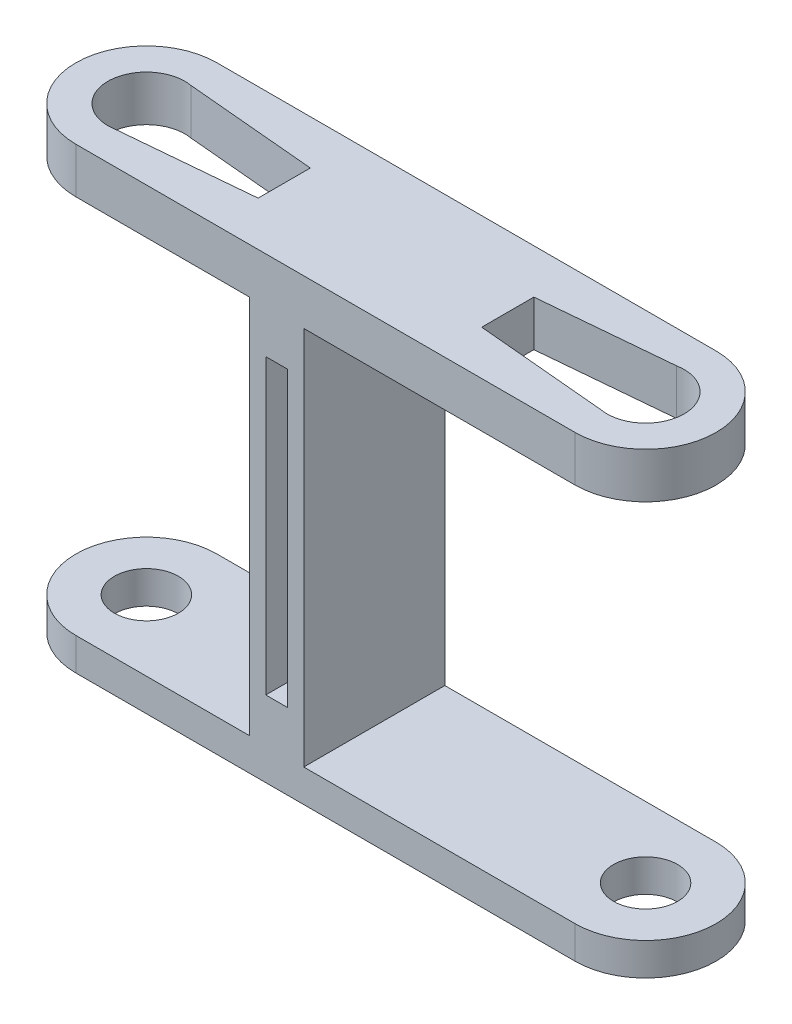
ISO-10303-21;
HEADER;
FILE_DESCRIPTION(('STEP AP214'),'2;1');
FILE_NAME('part.step','',(''),(''),'','','');
FILE_SCHEMA(('AUTOMOTIVE_DESIGN { 1 0 10303 214 1 1 1 1 }'));
ENDSEC;
DATA;
#1=APPLICATION_CONTEXT('core data for automotive mechanical design processes');
#2=APPLICATION_PROTOCOL_DEFINITION('international standard','automotive_design',2000,#1);
#3=PRODUCT_CONTEXT('',#1,'mechanical');
#4=PRODUCT('Part','Part','',(#3));
#5=PRODUCT_RELATED_PRODUCT_CATEGORY('part','',(#4));
#6=PRODUCT_DEFINITION_FORMATION('','',#4);
#7=PRODUCT_DEFINITION_CONTEXT('part definition',#1,'design');
#8=PRODUCT_DEFINITION('design','',#6,#7);
#9=PRODUCT_DEFINITION_SHAPE('','',#8);
#10=(LENGTH_UNIT() NAMED_UNIT(*) SI_UNIT(.MILLI.,.METRE.));
#11=(NAMED_UNIT(*) PLANE_ANGLE_UNIT() SI_UNIT($,.RADIAN.));
#12=(NAMED_UNIT(*) SI_UNIT($,.STERADIAN.) SOLID_ANGLE_UNIT());
#13=UNCERTAINTY_MEASURE_WITH_UNIT(LENGTH_MEASURE(1.E-05),#10,'distance_accuracy_value','');
#14=(GEOMETRIC_REPRESENTATION_CONTEXT(3) GLOBAL_UNCERTAINTY_ASSIGNED_CONTEXT((#13)) GLOBAL_UNIT_ASSIGNED_CONTEXT((#10,
#11,#12)) REPRESENTATION_CONTEXT('',''));
#15=CARTESIAN_POINT('',(0.,0.,0.));
#16=DIRECTION('',(0.,0.,1.));
#17=DIRECTION('',(1.,0.,0.));
#18=AXIS2_PLACEMENT_3D('',#15,#16,#17);
#19=CARTESIAN_POINT('',(0.,41.5,0.));
#20=DIRECTION('',(0.,1.,0.));
#21=DIRECTION('',(0.,0.,1.));
#22=AXIS2_PLACEMENT_3D('',#19,#20,#21);
#23=PLANE('',#22);
#24=DIRECTION('',(0.,0.,1.));
#25=VECTOR('',#24,1.);
#26=CARTESIAN_POINT('',(33.3,41.5,-2.40328140539589));
#27=LINE('',#26,#25);
#28=CARTESIAN_POINT('',(33.3,41.5,-2.40328140539589));
#29=VERTEX_POINT('',#28);
#30=CARTESIAN_POINT('',(33.3,41.5,2.40328140539589));
#31=VERTEX_POINT('',#30);
#32=EDGE_CURVE('E360',#29,#31,#27,.T.);
#33=ORIENTED_EDGE('',*,*,#32,.T.);
#34=DIRECTION('',(0.995948362239352,0.,0.0899269689956983));
#35=VECTOR('',#34,1.);
#36=CARTESIAN_POINT('',(33.3,41.5,2.40328140539589));
#37=LINE('',#36,#35);
#38=CARTESIAN_POINT('',(45.3641054158039,41.5,3.49258329575545));
#39=VERTEX_POINT('',#38);
#40=EDGE_CURVE('E365',#31,#39,#37,.T.);
#41=ORIENTED_EDGE('',*,*,#40,.T.);
#42=CARTESIAN_POINT('',(46.,41.5,0.));
#43=DIRECTION('',(0.,1.,0.));
#44=DIRECTION('',(0.,0.,1.));
#45=AXIS2_PLACEMENT_3D('',#42,#43,#44);
#46=CIRCLE('',#45,3.55);
#47=CARTESIAN_POINT('',(45.3641054158039,41.5,-3.49258329575545));
#48=VERTEX_POINT('',#47);
#49=EDGE_CURVE('E393',#39,#48,#46,.T.);
#50=ORIENTED_EDGE('',*,*,#49,.T.);
#51=DIRECTION('',(-0.995948362239352,0.,0.0899269689956983));
#52=VECTOR('',#51,1.);
#53=CARTESIAN_POINT('',(46.,41.5,-3.55));
#54=LINE('',#53,#52);
#55=EDGE_CURVE('E356',#48,#29,#54,.T.);
#56=ORIENTED_EDGE('',*,*,#55,.T.);
#57=EDGE_LOOP('',(#33,#41,#50,#56));
#58=FACE_BOUND('',#57,.T.);
#59=DIRECTION('',(0.,0.,1.));
#60=VECTOR('',#59,1.);
#61=CARTESIAN_POINT('',(21.,41.5,0.));
#62=LINE('',#61,#60);
#63=CARTESIAN_POINT('',(21.,41.5,-6.5));
#64=VERTEX_POINT('',#63);
#65=CARTESIAN_POINT('',(21.,41.5,6.5));
#66=VERTEX_POINT('',#65);
#67=EDGE_CURVE('E320',#64,#66,#62,.T.);
#68=ORIENTED_EDGE('',*,*,#67,.F.);
#69=DIRECTION('',(-1.,0.,0.));
#70=VECTOR('',#69,1.);
#71=CARTESIAN_POINT('',(0.,41.5,-6.5));
#72=LINE('',#71,#70);
#73=CARTESIAN_POINT('',(46.,41.5,-6.5));
#74=VERTEX_POINT('',#73);
#75=EDGE_CURVE('E409',#74,#64,#72,.T.);
#76=ORIENTED_EDGE('',*,*,#75,.F.);
#77=CARTESIAN_POINT('',(46.,41.5,0.));
#78=DIRECTION('',(0.,1.,0.));
#79=DIRECTION('',(0.,0.,1.));
#80=AXIS2_PLACEMENT_3D('',#77,#78,#79);
#81=CIRCLE('',#80,6.5);
#82=CARTESIAN_POINT('',(46.,41.5,6.5));
#83=VERTEX_POINT('',#82);
#84=EDGE_CURVE('E388',#83,#74,#81,.T.);
#85=ORIENTED_EDGE('',*,*,#84,.F.);
#86=DIRECTION('',(1.,0.,0.));
#87=VECTOR('',#86,1.);
#88=CARTESIAN_POINT('',(0.,41.5,6.5));
#89=LINE('',#88,#87);
#90=EDGE_CURVE('E402',#66,#83,#89,.T.);
#91=ORIENTED_EDGE('',*,*,#90,.F.);
#92=EDGE_LOOP('',(#68,#76,#85,#91));
#93=FACE_BOUND('',#92,.T.);
#94=ADVANCED_FACE('F39',(#58,#93),#23,.F.);
#95=CARTESIAN_POINT('',(0.,45.7,0.));
#96=DIRECTION('',(0.,-1.,0.));
#97=DIRECTION('',(0.,0.,-1.));
#98=AXIS2_PLACEMENT_3D('',#95,#96,#97);
#99=CYLINDRICAL_SURFACE('',#98,6.5);
#100=DIRECTION('',(0.,-1.,0.));
#101=VECTOR('',#100,1.);
#102=CARTESIAN_POINT('',(0.,45.7,6.5));
#103=LINE('',#102,#101);
#104=CARTESIAN_POINT('',(0.,45.7,6.5));
#105=VERTEX_POINT('',#104);
#106=CARTESIAN_POINT('',(0.,41.5,6.5));
#107=VERTEX_POINT('',#106);
#108=EDGE_CURVE('E432',#105,#107,#103,.T.);
#109=ORIENTED_EDGE('',*,*,#108,.F.);
#110=CARTESIAN_POINT('',(0.,45.7,0.));
#111=DIRECTION('',(0.,1.,0.));
#112=DIRECTION('',(0.,0.,1.));
#113=AXIS2_PLACEMENT_3D('',#110,#111,#112);
#114=CIRCLE('',#113,6.5);
#115=CARTESIAN_POINT('',(0.,45.7,-6.5));
#116=VERTEX_POINT('',#115);
#117=EDGE_CURVE('E437',#116,#105,#114,.T.);
#118=ORIENTED_EDGE('',*,*,#117,.F.);
#119=DIRECTION('',(0.,-1.,0.));
#120=VECTOR('',#119,1.);
#121=CARTESIAN_POINT('',(0.,45.7,-6.5));
#122=LINE('',#121,#120);
#123=CARTESIAN_POINT('',(0.,41.5,-6.5));
#124=VERTEX_POINT('',#123);
#125=EDGE_CURVE('E412',#116,#124,#122,.T.);
#126=ORIENTED_EDGE('',*,*,#125,.T.);
#127=CARTESIAN_POINT('',(0.,41.5,0.));
#128=DIRECTION('',(0.,1.,0.));
#129=DIRECTION('',(0.,0.,1.));
#130=AXIS2_PLACEMENT_3D('',#127,#128,#129);
#131=CIRCLE('',#130,6.5);
#132=EDGE_CURVE('E436',#124,#107,#131,.T.);
#133=ORIENTED_EDGE('',*,*,#132,.T.);
#134=EDGE_LOOP('',(#109,#118,#126,#133));
#135=FACE_BOUND('',#134,.T.);
#136=ADVANCED_FACE('F41',(#135),#99,.T.);
#137=CARTESIAN_POINT('',(0.,45.7,0.));
#138=DIRECTION('',(0.,1.,0.));
#139=DIRECTION('',(0.,0.,1.));
#140=AXIS2_PLACEMENT_3D('',#137,#138,#139);
#141=PLANE('',#140);
#142=DIRECTION('',(1.,0.,0.));
#143=VECTOR('',#142,1.);
#144=CARTESIAN_POINT('',(0.,45.7,6.5));
#145=LINE('',#144,#143);
#146=CARTESIAN_POINT('',(46.,45.7,6.5));
#147=VERTEX_POINT('',#146);
#148=EDGE_CURVE('E405',#105,#147,#145,.T.);
#149=ORIENTED_EDGE('',*,*,#148,.T.);
#150=CARTESIAN_POINT('',(46.,45.7,0.));
#151=DIRECTION('',(0.,1.,0.));
#152=DIRECTION('',(0.,0.,1.));
#153=AXIS2_PLACEMENT_3D('',#150,#151,#152);
#154=CIRCLE('',#153,6.5);
#155=CARTESIAN_POINT('',(46.,45.7,-6.5));
#156=VERTEX_POINT('',#155);
#157=EDGE_CURVE('E398',#147,#156,#154,.T.);
#158=ORIENTED_EDGE('',*,*,#157,.T.);
#159=DIRECTION('',(-1.,0.,0.));
#160=VECTOR('',#159,1.);
#161=CARTESIAN_POINT('',(0.,45.7,-6.5));
#162=LINE('',#161,#160);
#163=EDGE_CURVE('E408',#156,#116,#162,.T.);
#164=ORIENTED_EDGE('',*,*,#163,.T.);
#165=ORIENTED_EDGE('',*,*,#117,.T.);
#166=EDGE_LOOP('',(#149,#158,#164,#165));
#167=FACE_BOUND('',#166,.T.);
#168=DIRECTION('',(-0.995948362239352,0.,-0.0899269689956985));
#169=VECTOR('',#168,1.);
#170=CARTESIAN_POINT('',(12.7,45.7,-2.40328140539589));
#171=LINE('',#170,#169);
#172=CARTESIAN_POINT('',(12.7,45.7,-2.40328140539589));
#173=VERTEX_POINT('',#172);
#174=CARTESIAN_POINT('',(0.635894584196152,45.7,-3.49258329575545));
#175=VERTEX_POINT('',#174);
#176=EDGE_CURVE('E329',#173,#175,#171,.T.);
#177=ORIENTED_EDGE('',*,*,#176,.F.);
#178=DIRECTION('',(0.,0.,-1.));
#179=VECTOR('',#178,1.);
#180=CARTESIAN_POINT('',(12.7,45.7,2.40328140539589));
#181=LINE('',#180,#179);
#182=CARTESIAN_POINT('',(12.7,45.7,2.40328140539589));
#183=VERTEX_POINT('',#182);
#184=EDGE_CURVE('E341',#183,#173,#181,.T.);
#185=ORIENTED_EDGE('',*,*,#184,.F.);
#186=DIRECTION('',(0.995948362239352,0.,-0.0899269689956985));
#187=VECTOR('',#186,1.);
#188=CARTESIAN_POINT('',(0.,45.7,3.55));
#189=LINE('',#188,#187);
#190=CARTESIAN_POINT('',(0.635894584196152,45.7,3.49258329575545));
#191=VERTEX_POINT('',#190);
#192=EDGE_CURVE('E338',#191,#183,#189,.T.);
#193=ORIENTED_EDGE('',*,*,#192,.F.);
#194=CARTESIAN_POINT('',(0.,45.7,0.));
#195=DIRECTION('',(0.,1.,0.));
#196=DIRECTION('',(0.,0.,1.));
#197=AXIS2_PLACEMENT_3D('',#194,#195,#196);
#198=CIRCLE('',#197,3.55);
#199=EDGE_CURVE('E389',#175,#191,#198,.T.);
#200=ORIENTED_EDGE('',*,*,#199,.F.);
#201=EDGE_LOOP('',(#177,#185,#193,#200));
#202=FACE_BOUND('',#201,.T.);
#203=DIRECTION('',(0.995948362239352,0.,0.0899269689956983));
#204=VECTOR('',#203,1.);
#205=CARTESIAN_POINT('',(33.3,45.7,2.40328140539589));
#206=LINE('',#205,#204);
#207=CARTESIAN_POINT('',(33.3,45.7,2.40328140539589));
#208=VERTEX_POINT('',#207);
#209=CARTESIAN_POINT('',(45.3641054158039,45.7,3.49258329575545));
#210=VERTEX_POINT('',#209);
#211=EDGE_CURVE('E361',#208,#210,#206,.T.);
#212=ORIENTED_EDGE('',*,*,#211,.F.);
#213=DIRECTION('',(0.,0.,1.));
#214=VECTOR('',#213,1.);
#215=CARTESIAN_POINT('',(33.3,45.7,-2.40328140539589));
#216=LINE('',#215,#214);
#217=CARTESIAN_POINT('',(33.3,45.7,-2.40328140539589));
#218=VERTEX_POINT('',#217);
#219=EDGE_CURVE('E372',#218,#208,#216,.T.);
#220=ORIENTED_EDGE('',*,*,#219,.F.);
#221=DIRECTION('',(-0.995948362239352,0.,0.0899269689956983));
#222=VECTOR('',#221,1.);
#223=CARTESIAN_POINT('',(46.,45.7,-3.55));
#224=LINE('',#223,#222);
#225=CARTESIAN_POINT('',(45.3641054158039,45.7,-3.49258329575545));
#226=VERTEX_POINT('',#225);
#227=EDGE_CURVE('E323',#226,#218,#224,.T.);
#228=ORIENTED_EDGE('',*,*,#227,.F.);
#229=CARTESIAN_POINT('',(46.,45.7,0.));
#230=DIRECTION('',(0.,1.,0.));
#231=DIRECTION('',(0.,0.,1.));
#232=AXIS2_PLACEMENT_3D('',#229,#230,#231);
#233=CIRCLE('',#232,3.55);
#234=EDGE_CURVE('E352',#210,#226,#233,.T.);
#235=ORIENTED_EDGE('',*,*,#234,.F.);
#236=EDGE_LOOP('',(#212,#220,#228,#235));
#237=FACE_BOUND('',#236,.T.);
#238=ADVANCED_FACE('F495',(#167,#202,#237),#141,.T.);
#239=DIRECTION('',(0.,0.,-1.));
#240=VECTOR('',#239,1.);
#241=CARTESIAN_POINT('',(12.7,41.5,2.40328140539589));
#242=LINE('',#241,#240);
#243=CARTESIAN_POINT('',(12.7,41.5,2.40328140539589));
#244=VERTEX_POINT('',#243);
#245=CARTESIAN_POINT('',(12.7,41.5,-2.40328140539589));
#246=VERTEX_POINT('',#245);
#247=EDGE_CURVE('E328',#244,#246,#242,.T.);
#248=ORIENTED_EDGE('',*,*,#247,.T.);
#249=DIRECTION('',(-0.995948362239352,0.,-0.0899269689956985));
#250=VECTOR('',#249,1.);
#251=CARTESIAN_POINT('',(12.7,41.5,-2.40328140539589));
#252=LINE('',#251,#250);
#253=CARTESIAN_POINT('',(0.635894584196152,41.5,-3.49258329575545));
#254=VERTEX_POINT('',#253);
#255=EDGE_CURVE('E333',#246,#254,#252,.T.);
#256=ORIENTED_EDGE('',*,*,#255,.T.);
#257=CARTESIAN_POINT('',(0.,41.5,0.));
#258=DIRECTION('',(0.,1.,0.));
#259=DIRECTION('',(0.,0.,1.));
#260=AXIS2_PLACEMENT_3D('',#257,#258,#259);
#261=CIRCLE('',#260,3.55);
#262=CARTESIAN_POINT('',(0.635894584196152,41.5,3.49258329575545));
#263=VERTEX_POINT('',#262);
#264=EDGE_CURVE('E384',#254,#263,#261,.T.);
#265=ORIENTED_EDGE('',*,*,#264,.T.);
#266=DIRECTION('',(0.995948362239352,0.,-0.0899269689956985));
#267=VECTOR('',#266,1.);
#268=CARTESIAN_POINT('',(0.,41.5,3.55));
#269=LINE('',#268,#267);
#270=EDGE_CURVE('E324',#263,#244,#269,.T.);
#271=ORIENTED_EDGE('',*,*,#270,.T.);
#272=EDGE_LOOP('',(#248,#256,#265,#271));
#273=FACE_BOUND('',#272,.T.);
#274=CARTESIAN_POINT('',(16.,41.5,-6.5));
#275=VERTEX_POINT('',#274);
#276=EDGE_CURVE('E417',#275,#124,#72,.T.);
#277=ORIENTED_EDGE('',*,*,#276,.F.);
#278=DIRECTION('',(0.,0.,1.));
#279=VECTOR('',#278,1.);
#280=CARTESIAN_POINT('',(16.,41.5,0.));
#281=LINE('',#280,#279);
#282=CARTESIAN_POINT('',(16.,41.5,6.5));
#283=VERTEX_POINT('',#282);
#284=EDGE_CURVE('E316',#275,#283,#281,.T.);
#285=ORIENTED_EDGE('',*,*,#284,.T.);
#286=EDGE_CURVE('E413',#107,#283,#89,.T.);
#287=ORIENTED_EDGE('',*,*,#286,.F.);
#288=ORIENTED_EDGE('',*,*,#132,.F.);
#289=EDGE_LOOP('',(#277,#285,#287,#288));
#290=FACE_BOUND('',#289,.T.);
#291=ADVANCED_FACE('F491',(#273,#290),#23,.F.);
#292=CARTESIAN_POINT('',(0.,45.7,6.5));
#293=DIRECTION('',(0.,0.,-1.));
#294=DIRECTION('',(-1.,0.,0.));
#295=AXIS2_PLACEMENT_3D('',#292,#293,#294);
#296=PLANE('',#295);
#297=DIRECTION('',(1.,0.,0.));
#298=VECTOR('',#297,1.);
#299=CARTESIAN_POINT('',(17.5,10.5,6.5));
#300=LINE('',#299,#298);
#301=CARTESIAN_POINT('',(17.5,10.5,6.5));
#302=VERTEX_POINT('',#301);
#303=CARTESIAN_POINT('',(19.5,10.5,6.5));
#304=VERTEX_POINT('',#303);
#305=EDGE_CURVE('E214',#302,#304,#300,.T.);
#306=ORIENTED_EDGE('',*,*,#305,.F.);
#307=DIRECTION('',(0.,-1.,0.));
#308=VECTOR('',#307,1.);
#309=CARTESIAN_POINT('',(17.5,10.5,6.5));
#310=LINE('',#309,#308);
#311=CARTESIAN_POINT('',(17.5,37.5,6.5));
#312=VERTEX_POINT('',#311);
#313=EDGE_CURVE('E55',#312,#302,#310,.T.);
#314=ORIENTED_EDGE('',*,*,#313,.F.);
#315=DIRECTION('',(-1.,0.,0.));
#316=VECTOR('',#315,1.);
#317=CARTESIAN_POINT('',(17.5,37.5,6.5));
#318=LINE('',#317,#316);
#319=CARTESIAN_POINT('',(19.5,37.5,6.5));
#320=VERTEX_POINT('',#319);
#321=EDGE_CURVE('E222',#320,#312,#318,.T.);
#322=ORIENTED_EDGE('',*,*,#321,.F.);
#323=DIRECTION('',(0.,1.,0.));
#324=VECTOR('',#323,1.);
#325=CARTESIAN_POINT('',(19.5,10.5,6.5));
#326=LINE('',#325,#324);
#327=EDGE_CURVE('E204',#304,#320,#326,.T.);
#328=ORIENTED_EDGE('',*,*,#327,.F.);
#329=EDGE_LOOP('',(#306,#314,#322,#328));
#330=FACE_BOUND('',#329,.T.);
#331=DIRECTION('',(0.,-1.,0.));
#332=VECTOR('',#331,1.);
#333=CARTESIAN_POINT('',(16.,3.5,6.5));
#334=LINE('',#333,#332);
#335=CARTESIAN_POINT('',(16.,6.5,6.5));
#336=VERTEX_POINT('',#335);
#337=EDGE_CURVE('E297',#283,#336,#334,.T.);
#338=ORIENTED_EDGE('',*,*,#337,.T.);
#339=DIRECTION('',(1.,0.,0.));
#340=VECTOR('',#339,1.);
#341=CARTESIAN_POINT('',(0.,6.5,6.5));
#342=LINE('',#341,#340);
#343=CARTESIAN_POINT('',(0.,6.5,6.5));
#344=VERTEX_POINT('',#343);
#345=EDGE_CURVE('E261',#344,#336,#342,.T.);
#346=ORIENTED_EDGE('',*,*,#345,.F.);
#347=DIRECTION('',(0.,-1.,0.));
#348=VECTOR('',#347,1.);
#349=CARTESIAN_POINT('',(0.,6.5,6.5));
#350=LINE('',#349,#348);
#351=CARTESIAN_POINT('',(0.,3.5,6.5));
#352=VERTEX_POINT('',#351);
#353=EDGE_CURVE('E281',#344,#352,#350,.T.);
#354=ORIENTED_EDGE('',*,*,#353,.T.);
#355=DIRECTION('',(-1.,0.,0.));
#356=VECTOR('',#355,1.);
#357=CARTESIAN_POINT('',(21.,3.5,6.5));
#358=LINE('',#357,#356);
#359=CARTESIAN_POINT('',(46.,3.5,6.5));
#360=VERTEX_POINT('',#359);
#361=EDGE_CURVE('E313',#360,#352,#358,.T.);
#362=ORIENTED_EDGE('',*,*,#361,.F.);
#363=DIRECTION('',(0.,-1.,0.));
#364=VECTOR('',#363,1.);
#365=CARTESIAN_POINT('',(46.,6.5,6.5));
#366=LINE('',#365,#364);
#367=CARTESIAN_POINT('',(46.,6.5,6.5));
#368=VERTEX_POINT('',#367);
#369=EDGE_CURVE('E277',#368,#360,#366,.T.);
#370=ORIENTED_EDGE('',*,*,#369,.F.);
#371=CARTESIAN_POINT('',(21.,6.5,6.5));
#372=VERTEX_POINT('',#371);
#373=EDGE_CURVE('E257',#372,#368,#342,.T.);
#374=ORIENTED_EDGE('',*,*,#373,.F.);
#375=DIRECTION('',(0.,-1.,0.));
#376=VECTOR('',#375,1.);
#377=CARTESIAN_POINT('',(21.,3.5,6.5));
#378=LINE('',#377,#376);
#379=EDGE_CURVE('E298',#66,#372,#378,.T.);
#380=ORIENTED_EDGE('',*,*,#379,.F.);
#381=ORIENTED_EDGE('',*,*,#90,.T.);
#382=DIRECTION('',(0.,-1.,0.));
#383=VECTOR('',#382,1.);
#384=CARTESIAN_POINT('',(46.,45.7,6.5));
#385=LINE('',#384,#383);
#386=EDGE_CURVE('E428',#147,#83,#385,.T.);
#387=ORIENTED_EDGE('',*,*,#386,.F.);
#388=ORIENTED_EDGE('',*,*,#148,.F.);
#389=ORIENTED_EDGE('',*,*,#108,.T.);
#390=ORIENTED_EDGE('',*,*,#286,.T.);
#391=EDGE_LOOP('',(#338,#346,#354,#362,#370,#374,#380,#381,#387,#388,#389,#390));
#392=FACE_BOUND('',#391,.T.);
#393=ADVANCED_FACE('F219',(#330,#392),#296,.F.);
#394=CARTESIAN_POINT('',(0.,45.7,-6.5));
#395=DIRECTION('',(0.,0.,1.));
#396=DIRECTION('',(1.,0.,0.));
#397=AXIS2_PLACEMENT_3D('',#394,#395,#396);
#398=PLANE('',#397);
#399=DIRECTION('',(-1.,0.,0.));
#400=VECTOR('',#399,1.);
#401=CARTESIAN_POINT('',(0.,37.5,-6.5));
#402=LINE('',#401,#400);
#403=CARTESIAN_POINT('',(19.5,37.5,-6.5));
#404=VERTEX_POINT('',#403);
#405=CARTESIAN_POINT('',(17.5,37.5,-6.5));
#406=VERTEX_POINT('',#405);
#407=EDGE_CURVE('E48',#404,#406,#402,.T.);
#408=ORIENTED_EDGE('',*,*,#407,.T.);
#409=DIRECTION('',(0.,-1.,0.));
#410=VECTOR('',#409,1.);
#411=CARTESIAN_POINT('',(17.5,45.7,-6.5));
#412=LINE('',#411,#410);
#413=CARTESIAN_POINT('',(17.5,10.5,-6.5));
#414=VERTEX_POINT('',#413);
#415=EDGE_CURVE('E11',#406,#414,#412,.T.);
#416=ORIENTED_EDGE('',*,*,#415,.T.);
#417=DIRECTION('',(1.,0.,0.));
#418=VECTOR('',#417,1.);
#419=CARTESIAN_POINT('',(0.,10.5,-6.5));
#420=LINE('',#419,#418);
#421=CARTESIAN_POINT('',(19.5,10.5,-6.5));
#422=VERTEX_POINT('',#421);
#423=EDGE_CURVE('E463',#414,#422,#420,.T.);
#424=ORIENTED_EDGE('',*,*,#423,.T.);
#425=DIRECTION('',(0.,1.,0.));
#426=VECTOR('',#425,1.);
#427=CARTESIAN_POINT('',(19.5,45.7,-6.5));
#428=LINE('',#427,#426);
#429=EDGE_CURVE('E207',#422,#404,#428,.T.);
#430=ORIENTED_EDGE('',*,*,#429,.T.);
#431=EDGE_LOOP('',(#408,#416,#424,#430));
#432=FACE_BOUND('',#431,.T.);
#433=DIRECTION('',(0.,1.,0.));
#434=VECTOR('',#433,1.);
#435=CARTESIAN_POINT('',(21.,3.5,-6.5));
#436=LINE('',#435,#434);
#437=CARTESIAN_POINT('',(21.,6.5,-6.5));
#438=VERTEX_POINT('',#437);
#439=EDGE_CURVE('E301',#438,#64,#436,.T.);
#440=ORIENTED_EDGE('',*,*,#439,.F.);
#441=DIRECTION('',(-1.,0.,0.));
#442=VECTOR('',#441,1.);
#443=CARTESIAN_POINT('',(0.,6.5,-6.5));
#444=LINE('',#443,#442);
#445=CARTESIAN_POINT('',(46.,6.5,-6.5));
#446=VERTEX_POINT('',#445);
#447=EDGE_CURVE('E265',#446,#438,#444,.T.);
#448=ORIENTED_EDGE('',*,*,#447,.F.);
#449=DIRECTION('',(0.,-1.,0.));
#450=VECTOR('',#449,1.);
#451=CARTESIAN_POINT('',(46.,6.5,-6.5));
#452=LINE('',#451,#450);
#453=CARTESIAN_POINT('',(46.,3.5,-6.5));
#454=VERTEX_POINT('',#453);
#455=EDGE_CURVE('E273',#446,#454,#452,.T.);
#456=ORIENTED_EDGE('',*,*,#455,.T.);
#457=DIRECTION('',(-1.,0.,0.));
#458=VECTOR('',#457,1.);
#459=CARTESIAN_POINT('',(21.,3.5,-6.5));
#460=LINE('',#459,#458);
#461=CARTESIAN_POINT('',(0.,3.5,-6.5));
#462=VERTEX_POINT('',#461);
#463=EDGE_CURVE('E305',#454,#462,#460,.T.);
#464=ORIENTED_EDGE('',*,*,#463,.T.);
#465=DIRECTION('',(0.,-1.,0.));
#466=VECTOR('',#465,1.);
#467=CARTESIAN_POINT('',(0.,6.5,-6.5));
#468=LINE('',#467,#466);
#469=CARTESIAN_POINT('',(0.,6.5,-6.5));
#470=VERTEX_POINT('',#469);
#471=EDGE_CURVE('E269',#470,#462,#468,.T.);
#472=ORIENTED_EDGE('',*,*,#471,.F.);
#473=CARTESIAN_POINT('',(16.,6.5,-6.5));
#474=VERTEX_POINT('',#473);
#475=EDGE_CURVE('E264',#474,#470,#444,.T.);
#476=ORIENTED_EDGE('',*,*,#475,.F.);
#477=DIRECTION('',(0.,1.,0.));
#478=VECTOR('',#477,1.);
#479=CARTESIAN_POINT('',(16.,3.5,-6.5));
#480=LINE('',#479,#478);
#481=EDGE_CURVE('E302',#474,#275,#480,.T.);
#482=ORIENTED_EDGE('',*,*,#481,.T.);
#483=ORIENTED_EDGE('',*,*,#276,.T.);
#484=ORIENTED_EDGE('',*,*,#125,.F.);
#485=ORIENTED_EDGE('',*,*,#163,.F.);
#486=DIRECTION('',(0.,-1.,0.));
#487=VECTOR('',#486,1.);
#488=CARTESIAN_POINT('',(46.,45.7,-6.5));
#489=LINE('',#488,#487);
#490=EDGE_CURVE('E424',#156,#74,#489,.T.);
#491=ORIENTED_EDGE('',*,*,#490,.T.);
#492=ORIENTED_EDGE('',*,*,#75,.T.);
#493=EDGE_LOOP('',(#440,#448,#456,#464,#472,#476,#482,#483,#484,#485,#491,#492));
#494=FACE_BOUND('',#493,.T.);
#495=ADVANCED_FACE('F470',(#432,#494),#398,.F.);
#496=CARTESIAN_POINT('',(46.,45.7,0.));
#497=DIRECTION('',(0.,-1.,0.));
#498=DIRECTION('',(0.,0.,-1.));
#499=AXIS2_PLACEMENT_3D('',#496,#497,#498);
#500=CYLINDRICAL_SURFACE('',#499,6.5);
#501=ORIENTED_EDGE('',*,*,#157,.F.);
#502=ORIENTED_EDGE('',*,*,#386,.T.);
#503=ORIENTED_EDGE('',*,*,#84,.T.);
#504=ORIENTED_EDGE('',*,*,#490,.F.);
#505=EDGE_LOOP('',(#501,#502,#503,#504));
#506=FACE_BOUND('',#505,.T.);
#507=ADVANCED_FACE('F546',(#506),#500,.T.);
#508=CARTESIAN_POINT('',(46.,41.5,0.));
#509=DIRECTION('',(0.,1.,0.));
#510=DIRECTION('',(0.,0.,1.));
#511=AXIS2_PLACEMENT_3D('',#508,#509,#510);
#512=CYLINDRICAL_SURFACE('',#511,3.55);
#513=ORIENTED_EDGE('',*,*,#234,.T.);
#514=DIRECTION('',(0.,1.,0.));
#515=VECTOR('',#514,1.);
#516=CARTESIAN_POINT('',(45.3641054158038,41.5,-3.49258329575545));
#517=LINE('',#516,#515);
#518=EDGE_CURVE('E451',#226,#48,#517,.F.);
#519=ORIENTED_EDGE('',*,*,#518,.T.);
#520=ORIENTED_EDGE('',*,*,#49,.F.);
#521=DIRECTION('',(0.,1.,0.));
#522=VECTOR('',#521,1.);
#523=CARTESIAN_POINT('',(45.3641054158038,41.5,3.49258329575545));
#524=LINE('',#523,#522);
#525=EDGE_CURVE('E455',#39,#210,#524,.T.);
#526=ORIENTED_EDGE('',*,*,#525,.T.);
#527=EDGE_LOOP('',(#513,#519,#520,#526));
#528=FACE_BOUND('',#527,.T.);
#529=ADVANCED_FACE('F603',(#528),#512,.F.);
#530=CARTESIAN_POINT('',(0.,41.5,0.));
#531=DIRECTION('',(0.,1.,0.));
#532=DIRECTION('',(0.,0.,1.));
#533=AXIS2_PLACEMENT_3D('',#530,#531,#532);
#534=CYLINDRICAL_SURFACE('',#533,3.55);
#535=ORIENTED_EDGE('',*,*,#199,.T.);
#536=DIRECTION('',(0.,1.,0.));
#537=VECTOR('',#536,1.);
#538=CARTESIAN_POINT('',(0.63589458419616,41.5,3.49258329575545));
#539=LINE('',#538,#537);
#540=EDGE_CURVE('E441',#191,#263,#539,.F.);
#541=ORIENTED_EDGE('',*,*,#540,.T.);
#542=ORIENTED_EDGE('',*,*,#264,.F.);
#543=DIRECTION('',(0.,1.,0.));
#544=VECTOR('',#543,1.);
#545=CARTESIAN_POINT('',(0.63589458419616,41.5,-3.49258329575545));
#546=LINE('',#545,#544);
#547=EDGE_CURVE('E447',#254,#175,#546,.T.);
#548=ORIENTED_EDGE('',*,*,#547,.T.);
#549=EDGE_LOOP('',(#535,#541,#542,#548));
#550=FACE_BOUND('',#549,.T.);
#551=ADVANCED_FACE('F581',(#550),#534,.F.);
#552=CARTESIAN_POINT('',(12.7,41.5,-2.40328140539589));
#553=DIRECTION('',(0.0899269689956985,0.,-0.995948362239351));
#554=DIRECTION('',(-0.995948362239352,0.,-0.0899269689956985));
#555=AXIS2_PLACEMENT_3D('',#552,#553,#554);
#556=PLANE('',#555);
#557=ORIENTED_EDGE('',*,*,#255,.F.);
#558=DIRECTION('',(0.,1.,0.));
#559=VECTOR('',#558,1.);
#560=CARTESIAN_POINT('',(12.7,41.5,-2.40328140539589));
#561=LINE('',#560,#559);
#562=EDGE_CURVE('E349',#246,#173,#561,.T.);
#563=ORIENTED_EDGE('',*,*,#562,.T.);
#564=ORIENTED_EDGE('',*,*,#176,.T.);
#565=ORIENTED_EDGE('',*,*,#547,.F.);
#566=EDGE_LOOP('',(#557,#563,#564,#565));
#567=FACE_BOUND('',#566,.T.);
#568=ADVANCED_FACE('F577',(#567),#556,.F.);
#569=CARTESIAN_POINT('',(0.,41.5,3.55));
#570=DIRECTION('',(0.0899269689956985,0.,0.995948362239351));
#571=DIRECTION('',(0.995948362239352,0.,-0.0899269689956985));
#572=AXIS2_PLACEMENT_3D('',#569,#570,#571);
#573=PLANE('',#572);
#574=ORIENTED_EDGE('',*,*,#192,.T.);
#575=DIRECTION('',(0.,1.,0.));
#576=VECTOR('',#575,1.);
#577=CARTESIAN_POINT('',(12.7,41.5,2.40328140539589));
#578=LINE('',#577,#576);
#579=EDGE_CURVE('E337',#244,#183,#578,.T.);
#580=ORIENTED_EDGE('',*,*,#579,.F.);
#581=ORIENTED_EDGE('',*,*,#270,.F.);
#582=ORIENTED_EDGE('',*,*,#540,.F.);
#583=EDGE_LOOP('',(#574,#580,#581,#582));
#584=FACE_BOUND('',#583,.T.);
#585=ADVANCED_FACE('F580',(#584),#573,.F.);
#586=CARTESIAN_POINT('',(12.7,41.5,2.40328140539589));
#587=DIRECTION('',(1.,0.,0.));
#588=DIRECTION('',(0.,0.,-1.));
#589=AXIS2_PLACEMENT_3D('',#586,#587,#588);
#590=PLANE('',#589);
#591=ORIENTED_EDGE('',*,*,#184,.T.);
#592=ORIENTED_EDGE('',*,*,#562,.F.);
#593=ORIENTED_EDGE('',*,*,#247,.F.);
#594=ORIENTED_EDGE('',*,*,#579,.T.);
#595=EDGE_LOOP('',(#591,#592,#593,#594));
#596=FACE_BOUND('',#595,.T.);
#597=ADVANCED_FACE('F583',(#596),#590,.F.);
#598=CARTESIAN_POINT('',(33.3,41.5,2.40328140539589));
#599=DIRECTION('',(-0.0899269689956983,0.,0.995948362239352));
#600=DIRECTION('',(0.995948362239352,0.,0.0899269689956983));
#601=AXIS2_PLACEMENT_3D('',#598,#599,#600);
#602=PLANE('',#601);
#603=ORIENTED_EDGE('',*,*,#40,.F.);
#604=DIRECTION('',(0.,1.,0.));
#605=VECTOR('',#604,1.);
#606=CARTESIAN_POINT('',(33.3,41.5,2.40328140539589));
#607=LINE('',#606,#605);
#608=EDGE_CURVE('E342',#31,#208,#607,.T.);
#609=ORIENTED_EDGE('',*,*,#608,.T.);
#610=ORIENTED_EDGE('',*,*,#211,.T.);
#611=ORIENTED_EDGE('',*,*,#525,.F.);
#612=EDGE_LOOP('',(#603,#609,#610,#611));
#613=FACE_BOUND('',#612,.T.);
#614=ADVANCED_FACE('F586',(#613),#602,.F.);
#615=CARTESIAN_POINT('',(46.,41.5,-3.55));
#616=DIRECTION('',(-0.0899269689956983,0.,-0.995948362239352));
#617=DIRECTION('',(-0.995948362239352,0.,0.0899269689956983));
#618=AXIS2_PLACEMENT_3D('',#615,#616,#617);
#619=PLANE('',#618);
#620=ORIENTED_EDGE('',*,*,#227,.T.);
#621=DIRECTION('',(0.,1.,0.));
#622=VECTOR('',#621,1.);
#623=CARTESIAN_POINT('',(33.3,41.5,-2.40328140539589));
#624=LINE('',#623,#622);
#625=EDGE_CURVE('E369',#29,#218,#624,.T.);
#626=ORIENTED_EDGE('',*,*,#625,.F.);
#627=ORIENTED_EDGE('',*,*,#55,.F.);
#628=ORIENTED_EDGE('',*,*,#518,.F.);
#629=EDGE_LOOP('',(#620,#626,#627,#628));
#630=FACE_BOUND('',#629,.T.);
#631=ADVANCED_FACE('F593',(#630),#619,.F.);
#632=CARTESIAN_POINT('',(33.3,41.5,-2.40328140539589));
#633=DIRECTION('',(-1.,0.,0.));
#634=DIRECTION('',(0.,0.,1.));
#635=AXIS2_PLACEMENT_3D('',#632,#633,#634);
#636=PLANE('',#635);
#637=ORIENTED_EDGE('',*,*,#219,.T.);
#638=ORIENTED_EDGE('',*,*,#608,.F.);
#639=ORIENTED_EDGE('',*,*,#32,.F.);
#640=ORIENTED_EDGE('',*,*,#625,.T.);
#641=EDGE_LOOP('',(#637,#638,#639,#640));
#642=FACE_BOUND('',#641,.T.);
#643=ADVANCED_FACE('F572',(#642),#636,.F.);
#644=CARTESIAN_POINT('',(21.,0.,0.));
#645=DIRECTION('',(-1.,0.,0.));
#646=DIRECTION('',(0.,0.,1.));
#647=AXIS2_PLACEMENT_3D('',#644,#645,#646);
#648=PLANE('',#647);
#649=ORIENTED_EDGE('',*,*,#379,.T.);
#650=DIRECTION('',(0.,0.,-1.));
#651=VECTOR('',#650,1.);
#652=CARTESIAN_POINT('',(21.,6.5,0.));
#653=LINE('',#652,#651);
#654=EDGE_CURVE('E290',#372,#438,#653,.T.);
#655=ORIENTED_EDGE('',*,*,#654,.T.);
#656=ORIENTED_EDGE('',*,*,#439,.T.);
#657=ORIENTED_EDGE('',*,*,#67,.T.);
#658=EDGE_LOOP('',(#649,#655,#656,#657));
#659=FACE_BOUND('',#658,.T.);
#660=ADVANCED_FACE('F540',(#659),#648,.F.);
#661=CARTESIAN_POINT('',(16.,0.,0.));
#662=DIRECTION('',(-1.,0.,0.));
#663=DIRECTION('',(0.,0.,1.));
#664=AXIS2_PLACEMENT_3D('',#661,#662,#663);
#665=PLANE('',#664);
#666=DIRECTION('',(0.,0.,-1.));
#667=VECTOR('',#666,1.);
#668=CARTESIAN_POINT('',(16.,6.5,0.));
#669=LINE('',#668,#667);
#670=EDGE_CURVE('E459',#336,#474,#669,.T.);
#671=ORIENTED_EDGE('',*,*,#670,.F.);
#672=ORIENTED_EDGE('',*,*,#337,.F.);
#673=ORIENTED_EDGE('',*,*,#284,.F.);
#674=ORIENTED_EDGE('',*,*,#481,.F.);
#675=EDGE_LOOP('',(#671,#672,#673,#674));
#676=FACE_BOUND('',#675,.T.);
#677=ADVANCED_FACE('F553',(#676),#665,.T.);
#678=CARTESIAN_POINT('',(21.,3.5,6.5));
#679=DIRECTION('',(0.,1.,0.));
#680=DIRECTION('',(0.,0.,1.));
#681=AXIS2_PLACEMENT_3D('',#678,#679,#680);
#682=PLANE('',#681);
#683=ORIENTED_EDGE('',*,*,#361,.T.);
#684=CARTESIAN_POINT('',(0.,3.5,0.));
#685=DIRECTION('',(0.,1.,0.));
#686=DIRECTION('',(0.,0.,1.));
#687=AXIS2_PLACEMENT_3D('',#684,#685,#686);
#688=CIRCLE('',#687,6.5);
#689=EDGE_CURVE('E285',#462,#352,#688,.T.);
#690=ORIENTED_EDGE('',*,*,#689,.F.);
#691=ORIENTED_EDGE('',*,*,#463,.F.);
#692=CARTESIAN_POINT('',(46.,3.5,0.));
#693=DIRECTION('',(0.,1.,0.));
#694=DIRECTION('',(0.,0.,1.));
#695=AXIS2_PLACEMENT_3D('',#692,#693,#694);
#696=CIRCLE('',#695,6.5);
#697=EDGE_CURVE('E241',#360,#454,#696,.T.);
#698=ORIENTED_EDGE('',*,*,#697,.F.);
#699=EDGE_LOOP('',(#683,#690,#691,#698));
#700=FACE_BOUND('',#699,.T.);
#701=CARTESIAN_POINT('',(0.,3.5,0.));
#702=DIRECTION('',(0.,1.,0.));
#703=DIRECTION('',(0.,0.,1.));
#704=AXIS2_PLACEMENT_3D('',#701,#702,#703);
#705=CIRCLE('',#704,2.95);
#706=CARTESIAN_POINT('',(0.,3.5,2.95));
#707=VERTEX_POINT('',#706);
#708=EDGE_CURVE('E237',#707,#707,#705,.T.);
#709=ORIENTED_EDGE('',*,*,#708,.T.);
#710=EDGE_LOOP('',(#709));
#711=FACE_BOUND('',#710,.T.);
#712=CARTESIAN_POINT('',(46.,3.5,0.));
#713=DIRECTION('',(0.,1.,0.));
#714=DIRECTION('',(0.,0.,1.));
#715=AXIS2_PLACEMENT_3D('',#712,#713,#714);
#716=CIRCLE('',#715,2.95);
#717=CARTESIAN_POINT('',(46.,3.5,2.95));
#718=VERTEX_POINT('',#717);
#719=EDGE_CURVE('E246',#718,#718,#716,.T.);
#720=ORIENTED_EDGE('',*,*,#719,.T.);
#721=EDGE_LOOP('',(#720));
#722=FACE_BOUND('',#721,.T.);
#723=ADVANCED_FACE('F531',(#700,#711,#722),#682,.F.);
#724=CARTESIAN_POINT('',(0.,3.5,0.));
#725=DIRECTION('',(0.,1.,0.));
#726=DIRECTION('',(0.,0.,1.));
#727=AXIS2_PLACEMENT_3D('',#724,#725,#726);
#728=CYLINDRICAL_SURFACE('',#727,2.95);
#729=ORIENTED_EDGE('',*,*,#708,.F.);
#730=EDGE_LOOP('',(#729));
#731=FACE_BOUND('',#730,.T.);
#732=CARTESIAN_POINT('',(0.,6.5,0.));
#733=DIRECTION('',(0.,1.,0.));
#734=DIRECTION('',(0.,0.,1.));
#735=AXIS2_PLACEMENT_3D('',#732,#733,#734);
#736=CIRCLE('',#735,2.95);
#737=CARTESIAN_POINT('',(0.,6.5,2.95));
#738=VERTEX_POINT('',#737);
#739=EDGE_CURVE('E242',#738,#738,#736,.T.);
#740=ORIENTED_EDGE('',*,*,#739,.T.);
#741=EDGE_LOOP('',(#740));
#742=FACE_BOUND('',#741,.T.);
#743=ADVANCED_FACE('F565',(#731,#742),#728,.F.);
#744=CARTESIAN_POINT('',(0.,6.5,0.));
#745=DIRECTION('',(0.,-1.,0.));
#746=DIRECTION('',(0.,0.,-1.));
#747=AXIS2_PLACEMENT_3D('',#744,#745,#746);
#748=CYLINDRICAL_SURFACE('',#747,6.5);
#749=ORIENTED_EDGE('',*,*,#353,.F.);
#750=CARTESIAN_POINT('',(0.,6.5,0.));
#751=DIRECTION('',(0.,1.,0.));
#752=DIRECTION('',(0.,0.,1.));
#753=AXIS2_PLACEMENT_3D('',#750,#751,#752);
#754=CIRCLE('',#753,6.5);
#755=EDGE_CURVE('E286',#470,#344,#754,.T.);
#756=ORIENTED_EDGE('',*,*,#755,.F.);
#757=ORIENTED_EDGE('',*,*,#471,.T.);
#758=ORIENTED_EDGE('',*,*,#689,.T.);
#759=EDGE_LOOP('',(#749,#756,#757,#758));
#760=FACE_BOUND('',#759,.T.);
#761=ADVANCED_FACE('F534',(#760),#748,.T.);
#762=CARTESIAN_POINT('',(0.,6.5,0.));
#763=DIRECTION('',(0.,1.,0.));
#764=DIRECTION('',(0.,0.,1.));
#765=AXIS2_PLACEMENT_3D('',#762,#763,#764);
#766=PLANE('',#765);
#767=ORIENTED_EDGE('',*,*,#739,.F.);
#768=EDGE_LOOP('',(#767));
#769=FACE_BOUND('',#768,.T.);
#770=ORIENTED_EDGE('',*,*,#345,.T.);
#771=ORIENTED_EDGE('',*,*,#670,.T.);
#772=ORIENTED_EDGE('',*,*,#475,.T.);
#773=ORIENTED_EDGE('',*,*,#755,.T.);
#774=EDGE_LOOP('',(#770,#771,#772,#773));
#775=FACE_BOUND('',#774,.T.);
#776=ADVANCED_FACE('F556',(#769,#775),#766,.T.);
#777=CARTESIAN_POINT('',(46.,6.5,0.));
#778=DIRECTION('',(0.,1.,0.));
#779=DIRECTION('',(0.,0.,1.));
#780=AXIS2_PLACEMENT_3D('',#777,#778,#779);
#781=CIRCLE('',#780,2.95);
#782=CARTESIAN_POINT('',(46.,6.5,2.95));
#783=VERTEX_POINT('',#782);
#784=EDGE_CURVE('E232',#783,#783,#781,.T.);
#785=ORIENTED_EDGE('',*,*,#784,.F.);
#786=EDGE_LOOP('',(#785));
#787=FACE_BOUND('',#786,.T.);
#788=ORIENTED_EDGE('',*,*,#654,.F.);
#789=ORIENTED_EDGE('',*,*,#373,.T.);
#790=CARTESIAN_POINT('',(46.,6.5,0.));
#791=DIRECTION('',(0.,1.,0.));
#792=DIRECTION('',(0.,0.,1.));
#793=AXIS2_PLACEMENT_3D('',#790,#791,#792);
#794=CIRCLE('',#793,6.5);
#795=EDGE_CURVE('E253',#368,#446,#794,.T.);
#796=ORIENTED_EDGE('',*,*,#795,.T.);
#797=ORIENTED_EDGE('',*,*,#447,.T.);
#798=EDGE_LOOP('',(#788,#789,#796,#797));
#799=FACE_BOUND('',#798,.T.);
#800=ADVANCED_FACE('F522',(#787,#799),#766,.T.);
#801=CARTESIAN_POINT('',(46.,6.5,0.));
#802=DIRECTION('',(0.,-1.,0.));
#803=DIRECTION('',(0.,0.,-1.));
#804=AXIS2_PLACEMENT_3D('',#801,#802,#803);
#805=CYLINDRICAL_SURFACE('',#804,6.5);
#806=ORIENTED_EDGE('',*,*,#795,.F.);
#807=ORIENTED_EDGE('',*,*,#369,.T.);
#808=ORIENTED_EDGE('',*,*,#697,.T.);
#809=ORIENTED_EDGE('',*,*,#455,.F.);
#810=EDGE_LOOP('',(#806,#807,#808,#809));
#811=FACE_BOUND('',#810,.T.);
#812=ADVANCED_FACE('F484',(#811),#805,.T.);
#813=CARTESIAN_POINT('',(46.,3.5,0.));
#814=DIRECTION('',(0.,1.,0.));
#815=DIRECTION('',(0.,0.,1.));
#816=AXIS2_PLACEMENT_3D('',#813,#814,#815);
#817=CYLINDRICAL_SURFACE('',#816,2.95);
#818=ORIENTED_EDGE('',*,*,#719,.F.);
#819=EDGE_LOOP('',(#818));
#820=FACE_BOUND('',#819,.T.);
#821=ORIENTED_EDGE('',*,*,#784,.T.);
#822=EDGE_LOOP('',(#821));
#823=FACE_BOUND('',#822,.T.);
#824=ADVANCED_FACE('F477',(#820,#823),#817,.F.);
#825=CARTESIAN_POINT('',(17.5,10.5,-6.52));
#826=DIRECTION('',(-1.,0.,0.));
#827=DIRECTION('',(0.,0.,1.));
#828=AXIS2_PLACEMENT_3D('',#825,#826,#827);
#829=PLANE('',#828);
#830=DIRECTION('',(0.,0.,1.));
#831=VECTOR('',#830,1.);
#832=CARTESIAN_POINT('',(17.5,37.5,-6.52));
#833=LINE('',#832,#831);
#834=EDGE_CURVE('E229',#406,#312,#833,.T.);
#835=ORIENTED_EDGE('',*,*,#834,.T.);
#836=ORIENTED_EDGE('',*,*,#313,.T.);
#837=DIRECTION('',(0.,0.,1.));
#838=VECTOR('',#837,1.);
#839=CARTESIAN_POINT('',(17.5,10.5,-6.52));
#840=LINE('',#839,#838);
#841=EDGE_CURVE('E211',#414,#302,#840,.T.);
#842=ORIENTED_EDGE('',*,*,#841,.F.);
#843=ORIENTED_EDGE('',*,*,#415,.F.);
#844=EDGE_LOOP('',(#835,#836,#842,#843));
#845=FACE_BOUND('',#844,.T.);
#846=ADVANCED_FACE('F475',(#845),#829,.F.);
#847=CARTESIAN_POINT('',(17.5,37.5,-6.52));
#848=DIRECTION('',(0.,1.,0.));
#849=DIRECTION('',(0.,0.,1.));
#850=AXIS2_PLACEMENT_3D('',#847,#848,#849);
#851=PLANE('',#850);
#852=DIRECTION('',(0.,0.,1.));
#853=VECTOR('',#852,1.);
#854=CARTESIAN_POINT('',(19.5,37.5,-6.52));
#855=LINE('',#854,#853);
#856=EDGE_CURVE('E210',#404,#320,#855,.T.);
#857=ORIENTED_EDGE('',*,*,#856,.T.);
#858=ORIENTED_EDGE('',*,*,#321,.T.);
#859=ORIENTED_EDGE('',*,*,#834,.F.);
#860=ORIENTED_EDGE('',*,*,#407,.F.);
#861=EDGE_LOOP('',(#857,#858,#859,#860));
#862=FACE_BOUND('',#861,.T.);
#863=ADVANCED_FACE('F474',(#862),#851,.F.);
#864=CARTESIAN_POINT('',(19.5,10.5,-6.52));
#865=DIRECTION('',(1.,0.,0.));
#866=DIRECTION('',(0.,0.,-1.));
#867=AXIS2_PLACEMENT_3D('',#864,#865,#866);
#868=PLANE('',#867);
#869=DIRECTION('',(0.,0.,1.));
#870=VECTOR('',#869,1.);
#871=CARTESIAN_POINT('',(19.5,10.5,-6.52));
#872=LINE('',#871,#870);
#873=EDGE_CURVE('E63',#422,#304,#872,.T.);
#874=ORIENTED_EDGE('',*,*,#873,.T.);
#875=ORIENTED_EDGE('',*,*,#327,.T.);
#876=ORIENTED_EDGE('',*,*,#856,.F.);
#877=ORIENTED_EDGE('',*,*,#429,.F.);
#878=EDGE_LOOP('',(#874,#875,#876,#877));
#879=FACE_BOUND('',#878,.T.);
#880=ADVANCED_FACE('F201',(#879),#868,.F.);
#881=CARTESIAN_POINT('',(17.5,10.5,-6.52));
#882=DIRECTION('',(0.,-1.,0.));
#883=DIRECTION('',(0.,0.,-1.));
#884=AXIS2_PLACEMENT_3D('',#881,#882,#883);
#885=PLANE('',#884);
#886=ORIENTED_EDGE('',*,*,#841,.T.);
#887=ORIENTED_EDGE('',*,*,#305,.T.);
#888=ORIENTED_EDGE('',*,*,#873,.F.);
#889=ORIENTED_EDGE('',*,*,#423,.F.);
#890=EDGE_LOOP('',(#886,#887,#888,#889));
#891=FACE_BOUND('',#890,.T.);
#892=ADVANCED_FACE('F215',(#891),#885,.F.);
#893=CLOSED_SHELL('',(#94,#136,#238,#291,#393,#495,#507,#529,#551,#568,#585,#597,#614,#631,#643,
#660,#677,#723,#743,#761,#776,#800,#812,#824,#846,#863,#880,#892));
#894=MANIFOLD_SOLID_BREP('B2',#893);
#895=ADVANCED_BREP_SHAPE_REPRESENTATION('',(#18,#894),#14);
#896=SHAPE_DEFINITION_REPRESENTATION(#9,#895);
ENDSEC;
END-ISO-10303-21;
